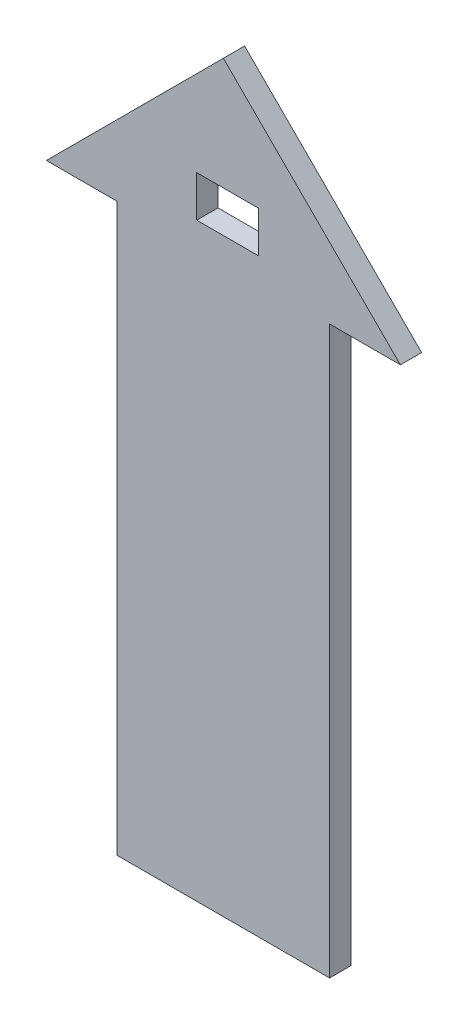
ISO-10303-21;
HEADER;
FILE_DESCRIPTION(('STEP AP214'),'2;1');
FILE_NAME('part.step','',(''),(''),'','','');
FILE_SCHEMA(('AUTOMOTIVE_DESIGN { 1 0 10303 214 1 1 1 1 }'));
ENDSEC;
DATA;
#1=APPLICATION_CONTEXT('core data for automotive mechanical design processes');
#2=APPLICATION_PROTOCOL_DEFINITION('international standard','automotive_design',2000,#1);
#3=PRODUCT_CONTEXT('',#1,'mechanical');
#4=PRODUCT('Part','Part','',(#3));
#5=PRODUCT_RELATED_PRODUCT_CATEGORY('part','',(#4));
#6=PRODUCT_DEFINITION_FORMATION('','',#4);
#7=PRODUCT_DEFINITION_CONTEXT('part definition',#1,'design');
#8=PRODUCT_DEFINITION('design','',#6,#7);
#9=PRODUCT_DEFINITION_SHAPE('','',#8);
#10=(LENGTH_UNIT() NAMED_UNIT(*) SI_UNIT(.MILLI.,.METRE.));
#11=(NAMED_UNIT(*) PLANE_ANGLE_UNIT() SI_UNIT($,.RADIAN.));
#12=(NAMED_UNIT(*) SI_UNIT($,.STERADIAN.) SOLID_ANGLE_UNIT());
#13=UNCERTAINTY_MEASURE_WITH_UNIT(LENGTH_MEASURE(1.E-05),#10,'distance_accuracy_value','');
#14=(GEOMETRIC_REPRESENTATION_CONTEXT(3) GLOBAL_UNCERTAINTY_ASSIGNED_CONTEXT((#13)) GLOBAL_UNIT_ASSIGNED_CONTEXT((#10,
#11,#12)) REPRESENTATION_CONTEXT('',''));
#15=CARTESIAN_POINT('',(0.,0.,0.));
#16=DIRECTION('',(0.,0.,1.));
#17=DIRECTION('',(1.,0.,0.));
#18=AXIS2_PLACEMENT_3D('',#15,#16,#17);
#19=CARTESIAN_POINT('',(0.,0.,3.));
#20=DIRECTION('',(1.,0.,0.));
#21=DIRECTION('',(0.,1.,0.));
#22=AXIS2_PLACEMENT_3D('',#19,#20,#21);
#23=PLANE('',#22);
#24=DIRECTION('',(0.,-1.,0.));
#25=VECTOR('',#24,1.);
#26=CARTESIAN_POINT('',(0.,0.,0.));
#27=LINE('',#26,#25);
#28=CARTESIAN_POINT('',(0.,80.,0.));
#29=VERTEX_POINT('',#28);
#30=CARTESIAN_POINT('',(0.,0.,0.));
#31=VERTEX_POINT('',#30);
#32=EDGE_CURVE('E148',#29,#31,#27,.T.);
#33=ORIENTED_EDGE('',*,*,#32,.T.);
#34=DIRECTION('',(0.,0.,-1.));
#35=VECTOR('',#34,1.);
#36=CARTESIAN_POINT('',(0.,0.,3.));
#37=LINE('',#36,#35);
#38=CARTESIAN_POINT('',(0.,0.,3.));
#39=VERTEX_POINT('',#38);
#40=EDGE_CURVE('E11',#39,#31,#37,.T.);
#41=ORIENTED_EDGE('',*,*,#40,.F.);
#42=DIRECTION('',(0.,-1.,0.));
#43=VECTOR('',#42,1.);
#44=CARTESIAN_POINT('',(0.,0.,3.));
#45=LINE('',#44,#43);
#46=CARTESIAN_POINT('',(0.,80.,3.));
#47=VERTEX_POINT('',#46);
#48=EDGE_CURVE('E152',#47,#39,#45,.T.);
#49=ORIENTED_EDGE('',*,*,#48,.F.);
#50=DIRECTION('',(0.,0.,-1.));
#51=VECTOR('',#50,1.);
#52=CARTESIAN_POINT('',(0.,80.,3.));
#53=LINE('',#52,#51);
#54=EDGE_CURVE('E168',#47,#29,#53,.T.);
#55=ORIENTED_EDGE('',*,*,#54,.T.);
#56=EDGE_LOOP('',(#33,#41,#49,#55));
#57=FACE_BOUND('',#56,.T.);
#58=ADVANCED_FACE('F33',(#57),#23,.F.);
#59=CARTESIAN_POINT('',(0.,0.,3.));
#60=DIRECTION('',(0.,1.,0.));
#61=DIRECTION('',(0.,0.,1.));
#62=AXIS2_PLACEMENT_3D('',#59,#60,#61);
#63=PLANE('',#62);
#64=DIRECTION('',(1.,0.,0.));
#65=VECTOR('',#64,1.);
#66=CARTESIAN_POINT('',(0.,0.,0.));
#67=LINE('',#66,#65);
#68=CARTESIAN_POINT('',(30.,0.,0.));
#69=VERTEX_POINT('',#68);
#70=EDGE_CURVE('E171',#31,#69,#67,.T.);
#71=ORIENTED_EDGE('',*,*,#70,.T.);
#72=DIRECTION('',(0.,0.,-1.));
#73=VECTOR('',#72,1.);
#74=CARTESIAN_POINT('',(30.,0.,3.));
#75=LINE('',#74,#73);
#76=CARTESIAN_POINT('',(30.,0.,3.));
#77=VERTEX_POINT('',#76);
#78=EDGE_CURVE('E40',#77,#69,#75,.T.);
#79=ORIENTED_EDGE('',*,*,#78,.F.);
#80=DIRECTION('',(1.,0.,0.));
#81=VECTOR('',#80,1.);
#82=CARTESIAN_POINT('',(0.,0.,3.));
#83=LINE('',#82,#81);
#84=EDGE_CURVE('E155',#39,#77,#83,.T.);
#85=ORIENTED_EDGE('',*,*,#84,.F.);
#86=ORIENTED_EDGE('',*,*,#40,.T.);
#87=EDGE_LOOP('',(#71,#79,#85,#86));
#88=FACE_BOUND('',#87,.T.);
#89=ADVANCED_FACE('F221',(#88),#63,.F.);
#90=CARTESIAN_POINT('',(30.,0.,3.));
#91=DIRECTION('',(-1.,0.,0.));
#92=DIRECTION('',(0.,0.,1.));
#93=AXIS2_PLACEMENT_3D('',#90,#91,#92);
#94=PLANE('',#93);
#95=DIRECTION('',(0.,1.,0.));
#96=VECTOR('',#95,1.);
#97=CARTESIAN_POINT('',(30.,0.,0.));
#98=LINE('',#97,#96);
#99=CARTESIAN_POINT('',(30.,80.,0.));
#100=VERTEX_POINT('',#99);
#101=EDGE_CURVE('E173',#69,#100,#98,.T.);
#102=ORIENTED_EDGE('',*,*,#101,.T.);
#103=DIRECTION('',(0.,0.,-1.));
#104=VECTOR('',#103,1.);
#105=CARTESIAN_POINT('',(30.,80.,3.));
#106=LINE('',#105,#104);
#107=CARTESIAN_POINT('',(30.,80.,3.));
#108=VERTEX_POINT('',#107);
#109=EDGE_CURVE('E193',#108,#100,#106,.T.);
#110=ORIENTED_EDGE('',*,*,#109,.F.);
#111=DIRECTION('',(0.,1.,0.));
#112=VECTOR('',#111,1.);
#113=CARTESIAN_POINT('',(30.,0.,3.));
#114=LINE('',#113,#112);
#115=EDGE_CURVE('E158',#77,#108,#114,.T.);
#116=ORIENTED_EDGE('',*,*,#115,.F.);
#117=ORIENTED_EDGE('',*,*,#78,.T.);
#118=EDGE_LOOP('',(#102,#110,#116,#117));
#119=FACE_BOUND('',#118,.T.);
#120=ADVANCED_FACE('F200',(#119),#94,.F.);
#121=CARTESIAN_POINT('',(30.,80.,3.));
#122=DIRECTION('',(0.,1.,0.));
#123=DIRECTION('',(0.,0.,1.));
#124=AXIS2_PLACEMENT_3D('',#121,#122,#123);
#125=PLANE('',#124);
#126=DIRECTION('',(1.,0.,0.));
#127=VECTOR('',#126,1.);
#128=CARTESIAN_POINT('',(30.,80.,0.));
#129=LINE('',#128,#127);
#130=CARTESIAN_POINT('',(40.,80.,0.));
#131=VERTEX_POINT('',#130);
#132=EDGE_CURVE('E175',#100,#131,#129,.T.);
#133=ORIENTED_EDGE('',*,*,#132,.T.);
#134=DIRECTION('',(0.,0.,-1.));
#135=VECTOR('',#134,1.);
#136=CARTESIAN_POINT('',(40.,80.,3.));
#137=LINE('',#136,#135);
#138=CARTESIAN_POINT('',(40.,80.,3.));
#139=VERTEX_POINT('',#138);
#140=EDGE_CURVE('E190',#139,#131,#137,.T.);
#141=ORIENTED_EDGE('',*,*,#140,.F.);
#142=DIRECTION('',(1.,0.,0.));
#143=VECTOR('',#142,1.);
#144=CARTESIAN_POINT('',(30.,80.,3.));
#145=LINE('',#144,#143);
#146=EDGE_CURVE('E160',#108,#139,#145,.T.);
#147=ORIENTED_EDGE('',*,*,#146,.F.);
#148=ORIENTED_EDGE('',*,*,#109,.T.);
#149=EDGE_LOOP('',(#133,#141,#147,#148));
#150=FACE_BOUND('',#149,.T.);
#151=ADVANCED_FACE('F209',(#150),#125,.F.);
#152=CARTESIAN_POINT('',(40.,80.,3.));
#153=DIRECTION('',(-0.707106781186547,-0.707106781186548,0.));
#154=DIRECTION('',(0.707106781186548,-0.707106781186547,0.));
#155=AXIS2_PLACEMENT_3D('',#152,#153,#154);
#156=PLANE('',#155);
#157=DIRECTION('',(-0.707106781186548,0.707106781186547,0.));
#158=VECTOR('',#157,1.);
#159=CARTESIAN_POINT('',(40.,80.,0.));
#160=LINE('',#159,#158);
#161=CARTESIAN_POINT('',(15.,105.,0.));
#162=VERTEX_POINT('',#161);
#163=EDGE_CURVE('E177',#131,#162,#160,.T.);
#164=ORIENTED_EDGE('',*,*,#163,.T.);
#165=DIRECTION('',(0.,0.,-1.));
#166=VECTOR('',#165,1.);
#167=CARTESIAN_POINT('',(15.,105.,3.));
#168=LINE('',#167,#166);
#169=CARTESIAN_POINT('',(15.,105.,3.));
#170=VERTEX_POINT('',#169);
#171=EDGE_CURVE('E187',#170,#162,#168,.T.);
#172=ORIENTED_EDGE('',*,*,#171,.F.);
#173=DIRECTION('',(-0.707106781186548,0.707106781186547,0.));
#174=VECTOR('',#173,1.);
#175=CARTESIAN_POINT('',(40.,80.,3.));
#176=LINE('',#175,#174);
#177=EDGE_CURVE('E162',#139,#170,#176,.T.);
#178=ORIENTED_EDGE('',*,*,#177,.F.);
#179=ORIENTED_EDGE('',*,*,#140,.T.);
#180=EDGE_LOOP('',(#164,#172,#178,#179));
#181=FACE_BOUND('',#180,.T.);
#182=ADVANCED_FACE('F213',(#181),#156,.F.);
#183=CARTESIAN_POINT('',(-10.,80.,3.));
#184=DIRECTION('',(0.707106781186547,-0.707106781186548,0.));
#185=DIRECTION('',(0.707106781186548,0.707106781186547,0.));
#186=AXIS2_PLACEMENT_3D('',#183,#184,#185);
#187=PLANE('',#186);
#188=DIRECTION('',(-0.707106781186548,-0.707106781186547,0.));
#189=VECTOR('',#188,1.);
#190=CARTESIAN_POINT('',(-10.,80.,0.));
#191=LINE('',#190,#189);
#192=CARTESIAN_POINT('',(-10.,80.,0.));
#193=VERTEX_POINT('',#192);
#194=EDGE_CURVE('E179',#162,#193,#191,.T.);
#195=ORIENTED_EDGE('',*,*,#194,.T.);
#196=DIRECTION('',(0.,0.,-1.));
#197=VECTOR('',#196,1.);
#198=CARTESIAN_POINT('',(-10.,80.,3.));
#199=LINE('',#198,#197);
#200=CARTESIAN_POINT('',(-10.,80.,3.));
#201=VERTEX_POINT('',#200);
#202=EDGE_CURVE('E184',#201,#193,#199,.T.);
#203=ORIENTED_EDGE('',*,*,#202,.F.);
#204=DIRECTION('',(-0.707106781186548,-0.707106781186547,0.));
#205=VECTOR('',#204,1.);
#206=CARTESIAN_POINT('',(-10.,80.,3.));
#207=LINE('',#206,#205);
#208=EDGE_CURVE('E164',#170,#201,#207,.T.);
#209=ORIENTED_EDGE('',*,*,#208,.F.);
#210=ORIENTED_EDGE('',*,*,#171,.T.);
#211=EDGE_LOOP('',(#195,#203,#209,#210));
#212=FACE_BOUND('',#211,.T.);
#213=ADVANCED_FACE('F229',(#212),#187,.F.);
#214=CARTESIAN_POINT('',(0.,80.,3.));
#215=DIRECTION('',(0.,1.,0.));
#216=DIRECTION('',(0.,0.,1.));
#217=AXIS2_PLACEMENT_3D('',#214,#215,#216);
#218=PLANE('',#217);
#219=DIRECTION('',(1.,0.,0.));
#220=VECTOR('',#219,1.);
#221=CARTESIAN_POINT('',(0.,80.,0.));
#222=LINE('',#221,#220);
#223=EDGE_CURVE('E156',#193,#29,#222,.T.);
#224=ORIENTED_EDGE('',*,*,#223,.T.);
#225=ORIENTED_EDGE('',*,*,#54,.F.);
#226=DIRECTION('',(1.,0.,0.));
#227=VECTOR('',#226,1.);
#228=CARTESIAN_POINT('',(0.,80.,3.));
#229=LINE('',#228,#227);
#230=EDGE_CURVE('E166',#201,#47,#229,.T.);
#231=ORIENTED_EDGE('',*,*,#230,.F.);
#232=ORIENTED_EDGE('',*,*,#202,.T.);
#233=EDGE_LOOP('',(#224,#225,#231,#232));
#234=FACE_BOUND('',#233,.T.);
#235=ADVANCED_FACE('F226',(#234),#218,.F.);
#236=CARTESIAN_POINT('',(0.,0.,3.));
#237=DIRECTION('',(0.,0.,1.));
#238=DIRECTION('',(1.,0.,0.));
#239=AXIS2_PLACEMENT_3D('',#236,#237,#238);
#240=PLANE('',#239);
#241=DIRECTION('',(0.,-1.,0.));
#242=VECTOR('',#241,1.);
#243=CARTESIAN_POINT('',(11.2358102051223,89.1338496920032,3.));
#244=LINE('',#243,#242);
#245=CARTESIAN_POINT('',(11.2358102051223,89.1338496920032,3.));
#246=VERTEX_POINT('',#245);
#247=CARTESIAN_POINT('',(11.2358102051223,83.315333344767,3.));
#248=VERTEX_POINT('',#247);
#249=EDGE_CURVE('E47',#246,#248,#244,.T.);
#250=ORIENTED_EDGE('',*,*,#249,.F.);
#251=DIRECTION('',(-1.,0.,0.));
#252=VECTOR('',#251,1.);
#253=CARTESIAN_POINT('',(11.2358102051223,89.1338496920032,3.));
#254=LINE('',#253,#252);
#255=CARTESIAN_POINT('',(19.9253050131658,89.1338496920032,3.));
#256=VERTEX_POINT('',#255);
#257=EDGE_CURVE('E133',#256,#246,#254,.T.);
#258=ORIENTED_EDGE('',*,*,#257,.F.);
#259=DIRECTION('',(0.,1.,0.));
#260=VECTOR('',#259,1.);
#261=CARTESIAN_POINT('',(19.9253050131658,89.1338496920032,3.));
#262=LINE('',#261,#260);
#263=CARTESIAN_POINT('',(19.9253050131658,83.315333344767,3.));
#264=VERTEX_POINT('',#263);
#265=EDGE_CURVE('E136',#264,#256,#262,.T.);
#266=ORIENTED_EDGE('',*,*,#265,.F.);
#267=DIRECTION('',(1.,0.,0.));
#268=VECTOR('',#267,1.);
#269=CARTESIAN_POINT('',(11.2358102051223,83.315333344767,3.));
#270=LINE('',#269,#268);
#271=EDGE_CURVE('E142',#248,#264,#270,.T.);
#272=ORIENTED_EDGE('',*,*,#271,.F.);
#273=EDGE_LOOP('',(#250,#258,#266,#272));
#274=FACE_BOUND('',#273,.T.);
#275=ORIENTED_EDGE('',*,*,#48,.T.);
#276=ORIENTED_EDGE('',*,*,#84,.T.);
#277=ORIENTED_EDGE('',*,*,#115,.T.);
#278=ORIENTED_EDGE('',*,*,#146,.T.);
#279=ORIENTED_EDGE('',*,*,#177,.T.);
#280=ORIENTED_EDGE('',*,*,#208,.T.);
#281=ORIENTED_EDGE('',*,*,#230,.T.);
#282=EDGE_LOOP('',(#275,#276,#277,#278,#279,#280,#281));
#283=FACE_BOUND('',#282,.T.);
#284=ADVANCED_FACE('F217',(#274,#283),#240,.T.);
#285=CARTESIAN_POINT('',(0.,0.,0.));
#286=DIRECTION('',(0.,0.,1.));
#287=DIRECTION('',(1.,0.,0.));
#288=AXIS2_PLACEMENT_3D('',#285,#286,#287);
#289=PLANE('',#288);
#290=DIRECTION('',(-1.,0.,0.));
#291=VECTOR('',#290,1.);
#292=CARTESIAN_POINT('',(11.2358102051223,89.1338496920032,0.));
#293=LINE('',#292,#291);
#294=CARTESIAN_POINT('',(19.9253050131658,89.1338496920032,0.));
#295=VERTEX_POINT('',#294);
#296=CARTESIAN_POINT('',(11.2358102051223,89.1338496920032,0.));
#297=VERTEX_POINT('',#296);
#298=EDGE_CURVE('E123',#295,#297,#293,.T.);
#299=ORIENTED_EDGE('',*,*,#298,.T.);
#300=DIRECTION('',(0.,-1.,0.));
#301=VECTOR('',#300,1.);
#302=CARTESIAN_POINT('',(11.2358102051223,89.1338496920032,0.));
#303=LINE('',#302,#301);
#304=CARTESIAN_POINT('',(11.2358102051223,83.315333344767,0.));
#305=VERTEX_POINT('',#304);
#306=EDGE_CURVE('E117',#297,#305,#303,.T.);
#307=ORIENTED_EDGE('',*,*,#306,.T.);
#308=DIRECTION('',(1.,0.,0.));
#309=VECTOR('',#308,1.);
#310=CARTESIAN_POINT('',(11.2358102051223,83.315333344767,0.));
#311=LINE('',#310,#309);
#312=CARTESIAN_POINT('',(19.9253050131658,83.315333344767,0.));
#313=VERTEX_POINT('',#312);
#314=EDGE_CURVE('E126',#305,#313,#311,.T.);
#315=ORIENTED_EDGE('',*,*,#314,.T.);
#316=DIRECTION('',(0.,1.,0.));
#317=VECTOR('',#316,1.);
#318=CARTESIAN_POINT('',(19.9253050131658,89.1338496920032,0.));
#319=LINE('',#318,#317);
#320=EDGE_CURVE('E55',#313,#295,#319,.T.);
#321=ORIENTED_EDGE('',*,*,#320,.T.);
#322=EDGE_LOOP('',(#299,#307,#315,#321));
#323=FACE_BOUND('',#322,.T.);
#324=ORIENTED_EDGE('',*,*,#32,.F.);
#325=ORIENTED_EDGE('',*,*,#223,.F.);
#326=ORIENTED_EDGE('',*,*,#194,.F.);
#327=ORIENTED_EDGE('',*,*,#163,.F.);
#328=ORIENTED_EDGE('',*,*,#132,.F.);
#329=ORIENTED_EDGE('',*,*,#101,.F.);
#330=ORIENTED_EDGE('',*,*,#70,.F.);
#331=EDGE_LOOP('',(#324,#325,#326,#327,#328,#329,#330));
#332=FACE_BOUND('',#331,.T.);
#333=ADVANCED_FACE('F130',(#323,#332),#289,.F.);
#334=CARTESIAN_POINT('',(11.2358102051223,89.1338496920032,0.));
#335=DIRECTION('',(-1.,0.,0.));
#336=DIRECTION('',(0.,0.,1.));
#337=AXIS2_PLACEMENT_3D('',#334,#335,#336);
#338=PLANE('',#337);
#339=ORIENTED_EDGE('',*,*,#249,.T.);
#340=DIRECTION('',(0.,0.,1.));
#341=VECTOR('',#340,1.);
#342=CARTESIAN_POINT('',(11.2358102051223,83.315333344767,0.));
#343=LINE('',#342,#341);
#344=EDGE_CURVE('E113',#305,#248,#343,.T.);
#345=ORIENTED_EDGE('',*,*,#344,.F.);
#346=ORIENTED_EDGE('',*,*,#306,.F.);
#347=DIRECTION('',(0.,0.,1.));
#348=VECTOR('',#347,1.);
#349=CARTESIAN_POINT('',(11.2358102051223,89.1338496920032,0.));
#350=LINE('',#349,#348);
#351=EDGE_CURVE('E146',#297,#246,#350,.T.);
#352=ORIENTED_EDGE('',*,*,#351,.T.);
#353=EDGE_LOOP('',(#339,#345,#346,#352));
#354=FACE_BOUND('',#353,.T.);
#355=ADVANCED_FACE('F115',(#354),#338,.F.);
#356=CARTESIAN_POINT('',(11.2358102051223,89.1338496920032,0.));
#357=DIRECTION('',(0.,1.,0.));
#358=DIRECTION('',(0.,0.,1.));
#359=AXIS2_PLACEMENT_3D('',#356,#357,#358);
#360=PLANE('',#359);
#361=ORIENTED_EDGE('',*,*,#257,.T.);
#362=ORIENTED_EDGE('',*,*,#351,.F.);
#363=ORIENTED_EDGE('',*,*,#298,.F.);
#364=DIRECTION('',(0.,0.,1.));
#365=VECTOR('',#364,1.);
#366=CARTESIAN_POINT('',(19.9253050131658,89.1338496920032,0.));
#367=LINE('',#366,#365);
#368=EDGE_CURVE('E149',#295,#256,#367,.T.);
#369=ORIENTED_EDGE('',*,*,#368,.T.);
#370=EDGE_LOOP('',(#361,#362,#363,#369));
#371=FACE_BOUND('',#370,.T.);
#372=ADVANCED_FACE('F292',(#371),#360,.F.);
#373=CARTESIAN_POINT('',(19.9253050131658,89.1338496920032,0.));
#374=DIRECTION('',(1.,0.,0.));
#375=DIRECTION('',(0.,0.,-1.));
#376=AXIS2_PLACEMENT_3D('',#373,#374,#375);
#377=PLANE('',#376);
#378=ORIENTED_EDGE('',*,*,#265,.T.);
#379=ORIENTED_EDGE('',*,*,#368,.F.);
#380=ORIENTED_EDGE('',*,*,#320,.F.);
#381=DIRECTION('',(0.,0.,1.));
#382=VECTOR('',#381,1.);
#383=CARTESIAN_POINT('',(19.9253050131658,83.315333344767,0.));
#384=LINE('',#383,#382);
#385=EDGE_CURVE('E122',#313,#264,#384,.T.);
#386=ORIENTED_EDGE('',*,*,#385,.T.);
#387=EDGE_LOOP('',(#378,#379,#380,#386));
#388=FACE_BOUND('',#387,.T.);
#389=ADVANCED_FACE('F301',(#388),#377,.F.);
#390=CARTESIAN_POINT('',(11.2358102051223,83.315333344767,0.));
#391=DIRECTION('',(0.,-1.,0.));
#392=DIRECTION('',(0.,0.,-1.));
#393=AXIS2_PLACEMENT_3D('',#390,#391,#392);
#394=PLANE('',#393);
#395=ORIENTED_EDGE('',*,*,#271,.T.);
#396=ORIENTED_EDGE('',*,*,#385,.F.);
#397=ORIENTED_EDGE('',*,*,#314,.F.);
#398=ORIENTED_EDGE('',*,*,#344,.T.);
#399=EDGE_LOOP('',(#395,#396,#397,#398));
#400=FACE_BOUND('',#399,.T.);
#401=ADVANCED_FACE('F127',(#400),#394,.F.);
#402=CLOSED_SHELL('',(#58,#89,#120,#151,#182,#213,#235,#284,#333,#355,#372,#389,#401));
#403=MANIFOLD_SOLID_BREP('B2',#402);
#404=ADVANCED_BREP_SHAPE_REPRESENTATION('',(#18,#403),#14);
#405=SHAPE_DEFINITION_REPRESENTATION(#9,#404);
ENDSEC;
END-ISO-10303-21;
